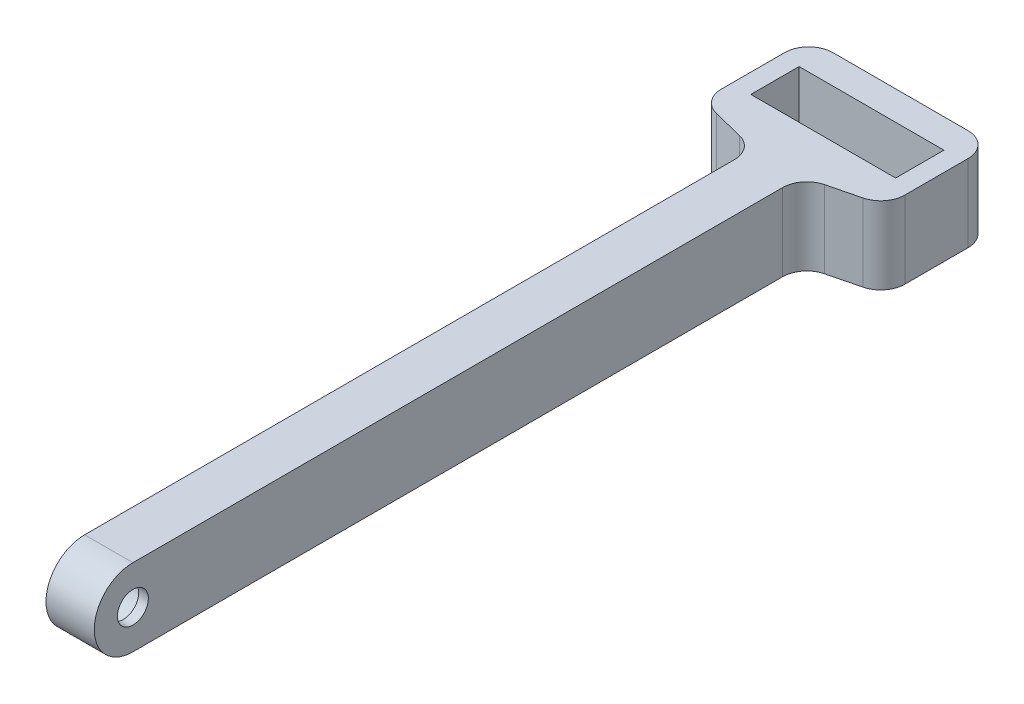
ISO-10303-21;
HEADER;
FILE_DESCRIPTION(('STEP AP214'),'2;1');
FILE_NAME('part.step','',(''),(''),'','','');
FILE_SCHEMA(('AUTOMOTIVE_DESIGN { 1 0 10303 214 1 1 1 1 }'));
ENDSEC;
DATA;
#1=APPLICATION_CONTEXT('core data for automotive mechanical design processes');
#2=APPLICATION_PROTOCOL_DEFINITION('international standard','automotive_design',2000,#1);
#3=PRODUCT_CONTEXT('',#1,'mechanical');
#4=PRODUCT('Part','Part','',(#3));
#5=PRODUCT_RELATED_PRODUCT_CATEGORY('part','',(#4));
#6=PRODUCT_DEFINITION_FORMATION('','',#4);
#7=PRODUCT_DEFINITION_CONTEXT('part definition',#1,'design');
#8=PRODUCT_DEFINITION('design','',#6,#7);
#9=PRODUCT_DEFINITION_SHAPE('','',#8);
#10=(LENGTH_UNIT() NAMED_UNIT(*) SI_UNIT(.MILLI.,.METRE.));
#11=(NAMED_UNIT(*) PLANE_ANGLE_UNIT() SI_UNIT($,.RADIAN.));
#12=(NAMED_UNIT(*) SI_UNIT($,.STERADIAN.) SOLID_ANGLE_UNIT());
#13=UNCERTAINTY_MEASURE_WITH_UNIT(LENGTH_MEASURE(1.E-05),#10,'distance_accuracy_value','');
#14=(GEOMETRIC_REPRESENTATION_CONTEXT(3) GLOBAL_UNCERTAINTY_ASSIGNED_CONTEXT((#13)) GLOBAL_UNIT_ASSIGNED_CONTEXT((#10,
#11,#12)) REPRESENTATION_CONTEXT('',''));
#15=CARTESIAN_POINT('',(0.,0.,0.));
#16=DIRECTION('',(0.,0.,1.));
#17=DIRECTION('',(1.,0.,0.));
#18=AXIS2_PLACEMENT_3D('',#15,#16,#17);
#19=CARTESIAN_POINT('',(5.,0.,30.));
#20=DIRECTION('',(-1.,0.,0.));
#21=DIRECTION('',(0.,0.,1.));
#22=AXIS2_PLACEMENT_3D('',#19,#20,#21);
#23=CYLINDRICAL_SURFACE('',#22,1.6);
#24=CARTESIAN_POINT('',(5.,0.,30.));
#25=DIRECTION('',(1.,0.,0.));
#26=DIRECTION('',(0.,0.,-1.));
#27=AXIS2_PLACEMENT_3D('',#24,#25,#26);
#28=CIRCLE('',#27,1.6);
#29=CARTESIAN_POINT('',(5.,0.,28.4));
#30=VERTEX_POINT('',#29);
#31=EDGE_CURVE('E222',#30,#30,#28,.T.);
#32=ORIENTED_EDGE('',*,*,#31,.T.);
#33=EDGE_LOOP('',(#32));
#34=FACE_BOUND('',#33,.T.);
#35=CARTESIAN_POINT('',(4.,0.,30.));
#36=DIRECTION('',(-1.,0.,0.));
#37=DIRECTION('',(0.,0.,1.));
#38=AXIS2_PLACEMENT_3D('',#35,#36,#37);
#39=CIRCLE('',#38,1.6);
#40=CARTESIAN_POINT('',(4.,0.,31.6));
#41=VERTEX_POINT('',#40);
#42=EDGE_CURVE('E200',#41,#41,#39,.T.);
#43=ORIENTED_EDGE('',*,*,#42,.T.);
#44=EDGE_LOOP('',(#43));
#45=FACE_BOUND('',#44,.T.);
#46=ADVANCED_FACE('F37',(#34,#45),#23,.F.);
#47=CARTESIAN_POINT('',(5.,0.,30.));
#48=DIRECTION('',(1.,0.,0.));
#49=DIRECTION('',(0.,0.,-1.));
#50=AXIS2_PLACEMENT_3D('',#47,#48,#49);
#51=PLANE('',#50);
#52=ORIENTED_EDGE('',*,*,#31,.F.);
#53=EDGE_LOOP('',(#52));
#54=FACE_BOUND('',#53,.T.);
#55=DIRECTION('',(0.,0.,-1.));
#56=VECTOR('',#55,1.);
#57=CARTESIAN_POINT('',(5.,-4.,-41.));
#58=LINE('',#57,#56);
#59=CARTESIAN_POINT('',(5.,-4.,30.));
#60=VERTEX_POINT('',#59);
#61=CARTESIAN_POINT('',(5.,-4.,-37.2980589839889));
#62=VERTEX_POINT('',#61);
#63=EDGE_CURVE('E233',#60,#62,#58,.T.);
#64=ORIENTED_EDGE('',*,*,#63,.T.);
#65=DIRECTION('',(0.,1.,0.));
#66=VECTOR('',#65,1.);
#67=CARTESIAN_POINT('',(5.,0.,-37.2980589839889));
#68=LINE('',#67,#66);
#69=CARTESIAN_POINT('',(5.,4.,-37.2980589839889));
#70=VERTEX_POINT('',#69);
#71=EDGE_CURVE('E251',#62,#70,#68,.T.);
#72=ORIENTED_EDGE('',*,*,#71,.T.);
#73=DIRECTION('',(0.,0.,1.));
#74=VECTOR('',#73,1.);
#75=CARTESIAN_POINT('',(5.,4.,30.));
#76=LINE('',#75,#74);
#77=CARTESIAN_POINT('',(5.,4.,30.));
#78=VERTEX_POINT('',#77);
#79=EDGE_CURVE('E237',#70,#78,#76,.T.);
#80=ORIENTED_EDGE('',*,*,#79,.T.);
#81=CARTESIAN_POINT('',(5.,0.,30.));
#82=DIRECTION('',(1.,0.,0.));
#83=DIRECTION('',(0.,0.,-1.));
#84=AXIS2_PLACEMENT_3D('',#81,#82,#83);
#85=CIRCLE('',#84,4.);
#86=EDGE_CURVE('E230',#78,#60,#85,.T.);
#87=ORIENTED_EDGE('',*,*,#86,.T.);
#88=EDGE_LOOP('',(#64,#72,#80,#87));
#89=FACE_BOUND('',#88,.T.);
#90=ADVANCED_FACE('F353',(#54,#89),#51,.T.);
#91=CARTESIAN_POINT('',(0.,0.,30.));
#92=DIRECTION('',(1.,0.,0.));
#93=DIRECTION('',(0.,0.,-1.));
#94=AXIS2_PLACEMENT_3D('',#91,#92,#93);
#95=PLANE('',#94);
#96=CARTESIAN_POINT('',(0.,0.,30.));
#97=DIRECTION('',(-1.,0.,0.));
#98=DIRECTION('',(0.,0.,1.));
#99=AXIS2_PLACEMENT_3D('',#96,#97,#98);
#100=CIRCLE('',#99,2.4);
#101=CARTESIAN_POINT('',(0.,0.,32.4));
#102=VERTEX_POINT('',#101);
#103=EDGE_CURVE('E337',#102,#102,#100,.T.);
#104=ORIENTED_EDGE('',*,*,#103,.F.);
#105=EDGE_LOOP('',(#104));
#106=FACE_BOUND('',#105,.T.);
#107=DIRECTION('',(0.,0.,1.));
#108=VECTOR('',#107,1.);
#109=CARTESIAN_POINT('',(0.,4.,30.));
#110=LINE('',#109,#108);
#111=CARTESIAN_POINT('',(0.,4.,-37.298058983989));
#112=VERTEX_POINT('',#111);
#113=CARTESIAN_POINT('',(0.,4.,30.));
#114=VERTEX_POINT('',#113);
#115=EDGE_CURVE('E234',#112,#114,#110,.T.);
#116=ORIENTED_EDGE('',*,*,#115,.F.);
#117=DIRECTION('',(0.,1.,0.));
#118=VECTOR('',#117,1.);
#119=CARTESIAN_POINT('',(0.,0.,-37.298058983989));
#120=LINE('',#119,#118);
#121=CARTESIAN_POINT('',(0.,-4.,-37.298058983989));
#122=VERTEX_POINT('',#121);
#123=EDGE_CURVE('E296',#112,#122,#120,.F.);
#124=ORIENTED_EDGE('',*,*,#123,.T.);
#125=DIRECTION('',(0.,0.,-1.));
#126=VECTOR('',#125,1.);
#127=CARTESIAN_POINT('',(0.,-4.,-41.));
#128=LINE('',#127,#126);
#129=CARTESIAN_POINT('',(0.,-4.,30.));
#130=VERTEX_POINT('',#129);
#131=EDGE_CURVE('E242',#130,#122,#128,.T.);
#132=ORIENTED_EDGE('',*,*,#131,.F.);
#133=CARTESIAN_POINT('',(0.,0.,30.));
#134=DIRECTION('',(1.,0.,0.));
#135=DIRECTION('',(0.,0.,-1.));
#136=AXIS2_PLACEMENT_3D('',#133,#134,#135);
#137=CIRCLE('',#136,4.);
#138=EDGE_CURVE('E229',#114,#130,#137,.T.);
#139=ORIENTED_EDGE('',*,*,#138,.F.);
#140=EDGE_LOOP('',(#116,#124,#132,#139));
#141=FACE_BOUND('',#140,.T.);
#142=ADVANCED_FACE('F313',(#106,#141),#95,.F.);
#143=CARTESIAN_POINT('',(5.,0.,30.));
#144=DIRECTION('',(-1.,0.,0.));
#145=DIRECTION('',(0.,0.,1.));
#146=AXIS2_PLACEMENT_3D('',#143,#144,#145);
#147=CYLINDRICAL_SURFACE('',#146,4.);
#148=ORIENTED_EDGE('',*,*,#138,.T.);
#149=DIRECTION('',(-1.,0.,0.));
#150=VECTOR('',#149,1.);
#151=CARTESIAN_POINT('',(5.,-4.,30.));
#152=LINE('',#151,#150);
#153=EDGE_CURVE('E248',#60,#130,#152,.T.);
#154=ORIENTED_EDGE('',*,*,#153,.F.);
#155=ORIENTED_EDGE('',*,*,#86,.F.);
#156=DIRECTION('',(-1.,0.,0.));
#157=VECTOR('',#156,1.);
#158=CARTESIAN_POINT('',(5.,4.,30.));
#159=LINE('',#158,#157);
#160=EDGE_CURVE('E239',#78,#114,#159,.T.);
#161=ORIENTED_EDGE('',*,*,#160,.T.);
#162=EDGE_LOOP('',(#148,#154,#155,#161));
#163=FACE_BOUND('',#162,.T.);
#164=ADVANCED_FACE('F352',(#163),#147,.T.);
#165=CARTESIAN_POINT('',(5.,-4.,-41.));
#166=DIRECTION('',(0.,1.,0.));
#167=DIRECTION('',(0.,0.,1.));
#168=AXIS2_PLACEMENT_3D('',#165,#166,#167);
#169=PLANE('',#168);
#170=DIRECTION('',(0.,0.,-1.));
#171=VECTOR('',#170,1.);
#172=CARTESIAN_POINT('',(12.,-4.,0.));
#173=LINE('',#172,#171);
#174=CARTESIAN_POINT('',(12.,-4.,-42.951941016011));
#175=VERTEX_POINT('',#174);
#176=CARTESIAN_POINT('',(12.,-4.,-49.5));
#177=VERTEX_POINT('',#176);
#178=EDGE_CURVE('E330',#175,#177,#173,.T.);
#179=ORIENTED_EDGE('',*,*,#178,.F.);
#180=CARTESIAN_POINT('',(9.5,-4.,-42.951941016011));
#181=DIRECTION('',(0.,1.,0.));
#182=DIRECTION('',(0.,0.,1.));
#183=AXIS2_PLACEMENT_3D('',#180,#181,#182);
#184=CIRCLE('',#183,2.5);
#185=CARTESIAN_POINT('',(10.1063390625908,-4.,-40.5265847656477));
#186=VERTEX_POINT('',#185);
#187=EDGE_CURVE('E280',#175,#186,#184,.F.);
#188=ORIENTED_EDGE('',*,*,#187,.T.);
#189=DIRECTION('',(-0.970142500145332,0.,0.242535625036333));
#190=VECTOR('',#189,1.);
#191=CARTESIAN_POINT('',(-8.94117647058824,-4.,-35.7647058823529));
#192=LINE('',#191,#190);
#193=CARTESIAN_POINT('',(6.89366093740917,-4.,-39.7234152343523));
#194=VERTEX_POINT('',#193);
#195=EDGE_CURVE('E220',#186,#194,#192,.T.);
#196=ORIENTED_EDGE('',*,*,#195,.T.);
#197=CARTESIAN_POINT('',(7.5,-4.,-37.2980589839889));
#198=DIRECTION('',(0.,1.,0.));
#199=DIRECTION('',(0.,0.,1.));
#200=AXIS2_PLACEMENT_3D('',#197,#198,#199);
#201=CIRCLE('',#200,2.5);
#202=EDGE_CURVE('E300',#194,#62,#201,.T.);
#203=ORIENTED_EDGE('',*,*,#202,.T.);
#204=ORIENTED_EDGE('',*,*,#63,.F.);
#205=ORIENTED_EDGE('',*,*,#153,.T.);
#206=ORIENTED_EDGE('',*,*,#131,.T.);
#207=CARTESIAN_POINT('',(-2.5,-4.,-37.298058983989));
#208=DIRECTION('',(0.,1.,0.));
#209=DIRECTION('',(0.,0.,1.));
#210=AXIS2_PLACEMENT_3D('',#207,#208,#209);
#211=CIRCLE('',#210,2.5);
#212=CARTESIAN_POINT('',(-1.89366093740917,-4.,-39.7234152343523));
#213=VERTEX_POINT('',#212);
#214=EDGE_CURVE('E11',#122,#213,#211,.T.);
#215=ORIENTED_EDGE('',*,*,#214,.T.);
#216=DIRECTION('',(0.970142500145332,0.,0.242535625036333));
#217=VECTOR('',#216,1.);
#218=CARTESIAN_POINT('',(9.23529411764707,-4.,-36.9411764705882));
#219=LINE('',#218,#217);
#220=CARTESIAN_POINT('',(-5.10633906259083,-4.,-40.5265847656477));
#221=VERTEX_POINT('',#220);
#222=EDGE_CURVE('E187',#221,#213,#219,.T.);
#223=ORIENTED_EDGE('',*,*,#222,.F.);
#224=CARTESIAN_POINT('',(-4.5,-4.,-42.951941016011));
#225=DIRECTION('',(0.,1.,0.));
#226=DIRECTION('',(0.,0.,1.));
#227=AXIS2_PLACEMENT_3D('',#224,#225,#226);
#228=CIRCLE('',#227,2.5);
#229=CARTESIAN_POINT('',(-7.,-4.,-42.951941016011));
#230=VERTEX_POINT('',#229);
#231=EDGE_CURVE('E275',#221,#230,#228,.F.);
#232=ORIENTED_EDGE('',*,*,#231,.T.);
#233=DIRECTION('',(0.,0.,-1.));
#234=VECTOR('',#233,1.);
#235=CARTESIAN_POINT('',(-6.99999999999999,-4.,0.));
#236=LINE('',#235,#234);
#237=CARTESIAN_POINT('',(-7.,-4.,-49.5));
#238=VERTEX_POINT('',#237);
#239=EDGE_CURVE('E190',#230,#238,#236,.T.);
#240=ORIENTED_EDGE('',*,*,#239,.T.);
#241=CARTESIAN_POINT('',(-4.5,-4.,-49.5));
#242=DIRECTION('',(0.,1.,0.));
#243=DIRECTION('',(0.,0.,1.));
#244=AXIS2_PLACEMENT_3D('',#241,#242,#243);
#245=CIRCLE('',#244,2.5);
#246=CARTESIAN_POINT('',(-4.5,-4.,-52.));
#247=VERTEX_POINT('',#246);
#248=EDGE_CURVE('E59',#238,#247,#245,.F.);
#249=ORIENTED_EDGE('',*,*,#248,.T.);
#250=DIRECTION('',(1.,0.,0.));
#251=VECTOR('',#250,1.);
#252=CARTESIAN_POINT('',(0.,-4.,-52.));
#253=LINE('',#252,#251);
#254=CARTESIAN_POINT('',(9.5,-4.,-52.));
#255=VERTEX_POINT('',#254);
#256=EDGE_CURVE('E329',#247,#255,#253,.T.);
#257=ORIENTED_EDGE('',*,*,#256,.T.);
#258=CARTESIAN_POINT('',(9.5,-4.,-49.5));
#259=DIRECTION('',(0.,1.,0.));
#260=DIRECTION('',(0.,0.,1.));
#261=AXIS2_PLACEMENT_3D('',#258,#259,#260);
#262=CIRCLE('',#261,2.5);
#263=EDGE_CURVE('E278',#255,#177,#262,.F.);
#264=ORIENTED_EDGE('',*,*,#263,.T.);
#265=EDGE_LOOP('',(#179,#188,#196,#203,#204,#205,#206,#215,#223,#232,#240,#249,#257,#264));
#266=FACE_BOUND('',#265,.T.);
#267=DIRECTION('',(-1.,0.,0.));
#268=VECTOR('',#267,1.);
#269=CARTESIAN_POINT('',(0.,-4.,-44.));
#270=LINE('',#269,#268);
#271=CARTESIAN_POINT('',(10.,-4.,-44.));
#272=VERTEX_POINT('',#271);
#273=CARTESIAN_POINT('',(-5.,-4.,-44.));
#274=VERTEX_POINT('',#273);
#275=EDGE_CURVE('E180',#272,#274,#270,.T.);
#276=ORIENTED_EDGE('',*,*,#275,.F.);
#277=DIRECTION('',(0.,0.,-1.));
#278=VECTOR('',#277,1.);
#279=CARTESIAN_POINT('',(10.,-4.,0.));
#280=LINE('',#279,#278);
#281=CARTESIAN_POINT('',(10.,-4.,-49.));
#282=VERTEX_POINT('',#281);
#283=EDGE_CURVE('E174',#272,#282,#280,.T.);
#284=ORIENTED_EDGE('',*,*,#283,.T.);
#285=DIRECTION('',(-1.,0.,0.));
#286=VECTOR('',#285,1.);
#287=CARTESIAN_POINT('',(0.,-4.,-49.));
#288=LINE('',#287,#286);
#289=CARTESIAN_POINT('',(-5.,-4.,-49.));
#290=VERTEX_POINT('',#289);
#291=EDGE_CURVE('E181',#282,#290,#288,.T.);
#292=ORIENTED_EDGE('',*,*,#291,.T.);
#293=DIRECTION('',(0.,0.,-1.));
#294=VECTOR('',#293,1.);
#295=CARTESIAN_POINT('',(-5.,-4.,0.));
#296=LINE('',#295,#294);
#297=EDGE_CURVE('E166',#274,#290,#296,.T.);
#298=ORIENTED_EDGE('',*,*,#297,.F.);
#299=EDGE_LOOP('',(#276,#284,#292,#298));
#300=FACE_BOUND('',#299,.T.);
#301=ADVANCED_FACE('F178',(#266,#300),#169,.F.);
#302=CARTESIAN_POINT('',(5.,4.,30.));
#303=DIRECTION('',(0.,-1.,0.));
#304=DIRECTION('',(0.,0.,-1.));
#305=AXIS2_PLACEMENT_3D('',#302,#303,#304);
#306=PLANE('',#305);
#307=DIRECTION('',(-0.970142500145332,0.,0.242535625036333));
#308=VECTOR('',#307,1.);
#309=CARTESIAN_POINT('',(-8.94117647058824,4.,-35.7647058823529));
#310=LINE('',#309,#308);
#311=CARTESIAN_POINT('',(10.1063390625908,4.,-40.5265847656477));
#312=VERTEX_POINT('',#311);
#313=CARTESIAN_POINT('',(6.89366093740917,4.,-39.7234152343523));
#314=VERTEX_POINT('',#313);
#315=EDGE_CURVE('E196',#312,#314,#310,.T.);
#316=ORIENTED_EDGE('',*,*,#315,.F.);
#317=CARTESIAN_POINT('',(9.5,4.,-42.951941016011));
#318=DIRECTION('',(0.,-1.,0.));
#319=DIRECTION('',(0.,0.,-1.));
#320=AXIS2_PLACEMENT_3D('',#317,#318,#319);
#321=CIRCLE('',#320,2.5);
#322=CARTESIAN_POINT('',(12.,4.,-42.951941016011));
#323=VERTEX_POINT('',#322);
#324=EDGE_CURVE('E268',#312,#323,#321,.F.);
#325=ORIENTED_EDGE('',*,*,#324,.T.);
#326=DIRECTION('',(0.,0.,-1.));
#327=VECTOR('',#326,1.);
#328=CARTESIAN_POINT('',(12.,4.,0.));
#329=LINE('',#328,#327);
#330=CARTESIAN_POINT('',(12.,4.,-49.5));
#331=VERTEX_POINT('',#330);
#332=EDGE_CURVE('E199',#323,#331,#329,.T.);
#333=ORIENTED_EDGE('',*,*,#332,.T.);
#334=CARTESIAN_POINT('',(9.5,4.,-49.5));
#335=DIRECTION('',(0.,-1.,0.));
#336=DIRECTION('',(0.,0.,-1.));
#337=AXIS2_PLACEMENT_3D('',#334,#335,#336);
#338=CIRCLE('',#337,2.5);
#339=CARTESIAN_POINT('',(9.5,4.,-52.));
#340=VERTEX_POINT('',#339);
#341=EDGE_CURVE('E266',#331,#340,#338,.F.);
#342=ORIENTED_EDGE('',*,*,#341,.T.);
#343=DIRECTION('',(1.,0.,0.));
#344=VECTOR('',#343,1.);
#345=CARTESIAN_POINT('',(0.,4.,-52.));
#346=LINE('',#345,#344);
#347=CARTESIAN_POINT('',(-4.5,4.,-52.));
#348=VERTEX_POINT('',#347);
#349=EDGE_CURVE('E203',#348,#340,#346,.T.);
#350=ORIENTED_EDGE('',*,*,#349,.F.);
#351=CARTESIAN_POINT('',(-4.5,4.,-49.5));
#352=DIRECTION('',(0.,-1.,0.));
#353=DIRECTION('',(0.,0.,-1.));
#354=AXIS2_PLACEMENT_3D('',#351,#352,#353);
#355=CIRCLE('',#354,2.5);
#356=CARTESIAN_POINT('',(-7.,4.,-49.5));
#357=VERTEX_POINT('',#356);
#358=EDGE_CURVE('E264',#348,#357,#355,.F.);
#359=ORIENTED_EDGE('',*,*,#358,.T.);
#360=DIRECTION('',(0.,0.,-1.));
#361=VECTOR('',#360,1.);
#362=CARTESIAN_POINT('',(-6.99999999999999,4.,0.));
#363=LINE('',#362,#361);
#364=CARTESIAN_POINT('',(-7.,4.,-42.951941016011));
#365=VERTEX_POINT('',#364);
#366=EDGE_CURVE('E205',#365,#357,#363,.T.);
#367=ORIENTED_EDGE('',*,*,#366,.F.);
#368=CARTESIAN_POINT('',(-4.5,4.,-42.951941016011));
#369=DIRECTION('',(0.,-1.,0.));
#370=DIRECTION('',(0.,0.,-1.));
#371=AXIS2_PLACEMENT_3D('',#368,#369,#370);
#372=CIRCLE('',#371,2.5);
#373=CARTESIAN_POINT('',(-5.10633906259083,4.,-40.5265847656477));
#374=VERTEX_POINT('',#373);
#375=EDGE_CURVE('E262',#365,#374,#372,.F.);
#376=ORIENTED_EDGE('',*,*,#375,.T.);
#377=DIRECTION('',(0.970142500145332,0.,0.242535625036333));
#378=VECTOR('',#377,1.);
#379=CARTESIAN_POINT('',(9.23529411764707,4.,-36.9411764705882));
#380=LINE('',#379,#378);
#381=CARTESIAN_POINT('',(-1.89366093740917,4.,-39.7234152343523));
#382=VERTEX_POINT('',#381);
#383=EDGE_CURVE('E208',#374,#382,#380,.T.);
#384=ORIENTED_EDGE('',*,*,#383,.T.);
#385=CARTESIAN_POINT('',(-2.5,4.,-37.298058983989));
#386=DIRECTION('',(0.,-1.,0.));
#387=DIRECTION('',(0.,0.,-1.));
#388=AXIS2_PLACEMENT_3D('',#385,#386,#387);
#389=CIRCLE('',#388,2.5);
#390=EDGE_CURVE('E45',#382,#112,#389,.T.);
#391=ORIENTED_EDGE('',*,*,#390,.T.);
#392=ORIENTED_EDGE('',*,*,#115,.T.);
#393=ORIENTED_EDGE('',*,*,#160,.F.);
#394=ORIENTED_EDGE('',*,*,#79,.F.);
#395=CARTESIAN_POINT('',(7.5,4.,-37.2980589839889));
#396=DIRECTION('',(0.,-1.,0.));
#397=DIRECTION('',(0.,0.,-1.));
#398=AXIS2_PLACEMENT_3D('',#395,#396,#397);
#399=CIRCLE('',#398,2.5);
#400=EDGE_CURVE('E298',#70,#314,#399,.T.);
#401=ORIENTED_EDGE('',*,*,#400,.T.);
#402=EDGE_LOOP('',(#316,#325,#333,#342,#350,#359,#367,#376,#384,#391,#392,#393,#394,#401));
#403=FACE_BOUND('',#402,.T.);
#404=DIRECTION('',(-1.,0.,0.));
#405=VECTOR('',#404,1.);
#406=CARTESIAN_POINT('',(0.,4.,-44.));
#407=LINE('',#406,#405);
#408=CARTESIAN_POINT('',(10.,4.,-44.));
#409=VERTEX_POINT('',#408);
#410=CARTESIAN_POINT('',(-5.,4.,-44.));
#411=VERTEX_POINT('',#410);
#412=EDGE_CURVE('E211',#409,#411,#407,.T.);
#413=ORIENTED_EDGE('',*,*,#412,.T.);
#414=DIRECTION('',(0.,0.,-1.));
#415=VECTOR('',#414,1.);
#416=CARTESIAN_POINT('',(-5.,4.,0.));
#417=LINE('',#416,#415);
#418=CARTESIAN_POINT('',(-5.,4.,-49.));
#419=VERTEX_POINT('',#418);
#420=EDGE_CURVE('E168',#411,#419,#417,.T.);
#421=ORIENTED_EDGE('',*,*,#420,.T.);
#422=DIRECTION('',(-1.,0.,0.));
#423=VECTOR('',#422,1.);
#424=CARTESIAN_POINT('',(0.,4.,-49.));
#425=LINE('',#424,#423);
#426=CARTESIAN_POINT('',(10.,4.,-49.));
#427=VERTEX_POINT('',#426);
#428=EDGE_CURVE('E214',#427,#419,#425,.T.);
#429=ORIENTED_EDGE('',*,*,#428,.F.);
#430=DIRECTION('',(0.,0.,-1.));
#431=VECTOR('',#430,1.);
#432=CARTESIAN_POINT('',(10.,4.,0.));
#433=LINE('',#432,#431);
#434=EDGE_CURVE('E217',#409,#427,#433,.T.);
#435=ORIENTED_EDGE('',*,*,#434,.F.);
#436=EDGE_LOOP('',(#413,#421,#429,#435));
#437=FACE_BOUND('',#436,.T.);
#438=ADVANCED_FACE('F304',(#403,#437),#306,.F.);
#439=CARTESIAN_POINT('',(0.,-4.,-44.));
#440=DIRECTION('',(0.,0.,-1.));
#441=DIRECTION('',(-1.,0.,0.));
#442=AXIS2_PLACEMENT_3D('',#439,#440,#441);
#443=PLANE('',#442);
#444=ORIENTED_EDGE('',*,*,#412,.F.);
#445=DIRECTION('',(0.,1.,0.));
#446=VECTOR('',#445,1.);
#447=CARTESIAN_POINT('',(10.,-4.,-44.));
#448=LINE('',#447,#446);
#449=EDGE_CURVE('E185',#272,#409,#448,.T.);
#450=ORIENTED_EDGE('',*,*,#449,.F.);
#451=ORIENTED_EDGE('',*,*,#275,.T.);
#452=DIRECTION('',(0.,1.,0.));
#453=VECTOR('',#452,1.);
#454=CARTESIAN_POINT('',(-5.,-4.,-44.));
#455=LINE('',#454,#453);
#456=EDGE_CURVE('E163',#274,#411,#455,.T.);
#457=ORIENTED_EDGE('',*,*,#456,.T.);
#458=EDGE_LOOP('',(#444,#450,#451,#457));
#459=FACE_BOUND('',#458,.T.);
#460=ADVANCED_FACE('F184',(#459),#443,.T.);
#461=CARTESIAN_POINT('',(10.,-4.,0.));
#462=DIRECTION('',(1.,0.,0.));
#463=DIRECTION('',(0.,0.,-1.));
#464=AXIS2_PLACEMENT_3D('',#461,#462,#463);
#465=PLANE('',#464);
#466=ORIENTED_EDGE('',*,*,#434,.T.);
#467=DIRECTION('',(0.,1.,0.));
#468=VECTOR('',#467,1.);
#469=CARTESIAN_POINT('',(10.,-4.,-49.));
#470=LINE('',#469,#468);
#471=EDGE_CURVE('E223',#282,#427,#470,.T.);
#472=ORIENTED_EDGE('',*,*,#471,.F.);
#473=ORIENTED_EDGE('',*,*,#283,.F.);
#474=ORIENTED_EDGE('',*,*,#449,.T.);
#475=EDGE_LOOP('',(#466,#472,#473,#474));
#476=FACE_BOUND('',#475,.T.);
#477=ADVANCED_FACE('F389',(#476),#465,.F.);
#478=CARTESIAN_POINT('',(0.,-4.,-49.));
#479=DIRECTION('',(0.,0.,-1.));
#480=DIRECTION('',(-1.,0.,0.));
#481=AXIS2_PLACEMENT_3D('',#478,#479,#480);
#482=PLANE('',#481);
#483=ORIENTED_EDGE('',*,*,#428,.T.);
#484=DIRECTION('',(0.,1.,0.));
#485=VECTOR('',#484,1.);
#486=CARTESIAN_POINT('',(-5.,-4.,-49.));
#487=LINE('',#486,#485);
#488=EDGE_CURVE('E173',#290,#419,#487,.T.);
#489=ORIENTED_EDGE('',*,*,#488,.F.);
#490=ORIENTED_EDGE('',*,*,#291,.F.);
#491=ORIENTED_EDGE('',*,*,#471,.T.);
#492=EDGE_LOOP('',(#483,#489,#490,#491));
#493=FACE_BOUND('',#492,.T.);
#494=ADVANCED_FACE('F386',(#493),#482,.F.);
#495=CARTESIAN_POINT('',(9.23529411764707,-4.,-36.9411764705882));
#496=DIRECTION('',(-0.242535625036333,0.,0.970142500145332));
#497=DIRECTION('',(0.970142500145332,0.,0.242535625036333));
#498=AXIS2_PLACEMENT_3D('',#495,#496,#497);
#499=PLANE('',#498);
#500=ORIENTED_EDGE('',*,*,#383,.F.);
#501=DIRECTION('',(0.,1.,0.));
#502=VECTOR('',#501,1.);
#503=CARTESIAN_POINT('',(-5.10633906259083,-4.,-40.5265847656477));
#504=LINE('',#503,#502);
#505=EDGE_CURVE('E294',#374,#221,#504,.F.);
#506=ORIENTED_EDGE('',*,*,#505,.T.);
#507=ORIENTED_EDGE('',*,*,#222,.T.);
#508=DIRECTION('',(0.,1.,0.));
#509=VECTOR('',#508,1.);
#510=CARTESIAN_POINT('',(-1.89366093740917,-4.,-39.7234152343523));
#511=LINE('',#510,#509);
#512=EDGE_CURVE('E291',#213,#382,#511,.T.);
#513=ORIENTED_EDGE('',*,*,#512,.T.);
#514=EDGE_LOOP('',(#500,#506,#507,#513));
#515=FACE_BOUND('',#514,.T.);
#516=ADVANCED_FACE('F319',(#515),#499,.T.);
#517=CARTESIAN_POINT('',(-6.99999999999999,-4.,0.));
#518=DIRECTION('',(1.,0.,0.));
#519=DIRECTION('',(0.,0.,-1.));
#520=AXIS2_PLACEMENT_3D('',#517,#518,#519);
#521=PLANE('',#520);
#522=ORIENTED_EDGE('',*,*,#366,.T.);
#523=DIRECTION('',(0.,1.,0.));
#524=VECTOR('',#523,1.);
#525=CARTESIAN_POINT('',(-7.,-4.,-49.5));
#526=LINE('',#525,#524);
#527=EDGE_CURVE('E289',#357,#238,#526,.F.);
#528=ORIENTED_EDGE('',*,*,#527,.T.);
#529=ORIENTED_EDGE('',*,*,#239,.F.);
#530=DIRECTION('',(0.,1.,0.));
#531=VECTOR('',#530,1.);
#532=CARTESIAN_POINT('',(-7.,4.,-42.951941016011));
#533=LINE('',#532,#531);
#534=EDGE_CURVE('E286',#230,#365,#533,.T.);
#535=ORIENTED_EDGE('',*,*,#534,.T.);
#536=EDGE_LOOP('',(#522,#528,#529,#535));
#537=FACE_BOUND('',#536,.T.);
#538=ADVANCED_FACE('F326',(#537),#521,.F.);
#539=CARTESIAN_POINT('',(0.,-4.,-52.));
#540=DIRECTION('',(0.,0.,1.));
#541=DIRECTION('',(1.,0.,0.));
#542=AXIS2_PLACEMENT_3D('',#539,#540,#541);
#543=PLANE('',#542);
#544=ORIENTED_EDGE('',*,*,#349,.T.);
#545=DIRECTION('',(0.,1.,0.));
#546=VECTOR('',#545,1.);
#547=CARTESIAN_POINT('',(9.5,-4.,-52.));
#548=LINE('',#547,#546);
#549=EDGE_CURVE('E52',#340,#255,#548,.F.);
#550=ORIENTED_EDGE('',*,*,#549,.T.);
#551=ORIENTED_EDGE('',*,*,#256,.F.);
#552=DIRECTION('',(0.,1.,0.));
#553=VECTOR('',#552,1.);
#554=CARTESIAN_POINT('',(-4.5,-4.,-52.));
#555=LINE('',#554,#553);
#556=EDGE_CURVE('E282',#247,#348,#555,.T.);
#557=ORIENTED_EDGE('',*,*,#556,.T.);
#558=EDGE_LOOP('',(#544,#550,#551,#557));
#559=FACE_BOUND('',#558,.T.);
#560=ADVANCED_FACE('F378',(#559),#543,.F.);
#561=CARTESIAN_POINT('',(12.,-4.,0.));
#562=DIRECTION('',(1.,0.,0.));
#563=DIRECTION('',(0.,0.,-1.));
#564=AXIS2_PLACEMENT_3D('',#561,#562,#563);
#565=PLANE('',#564);
#566=ORIENTED_EDGE('',*,*,#332,.F.);
#567=DIRECTION('',(0.,1.,0.));
#568=VECTOR('',#567,1.);
#569=CARTESIAN_POINT('',(12.,-4.,-42.951941016011));
#570=LINE('',#569,#568);
#571=EDGE_CURVE('E273',#323,#175,#570,.F.);
#572=ORIENTED_EDGE('',*,*,#571,.T.);
#573=ORIENTED_EDGE('',*,*,#178,.T.);
#574=DIRECTION('',(0.,1.,0.));
#575=VECTOR('',#574,1.);
#576=CARTESIAN_POINT('',(12.,4.,-49.5));
#577=LINE('',#576,#575);
#578=EDGE_CURVE('E270',#177,#331,#577,.T.);
#579=ORIENTED_EDGE('',*,*,#578,.T.);
#580=EDGE_LOOP('',(#566,#572,#573,#579));
#581=FACE_BOUND('',#580,.T.);
#582=ADVANCED_FACE('F374',(#581),#565,.T.);
#583=CARTESIAN_POINT('',(-8.94117647058824,-4.,-35.7647058823529));
#584=DIRECTION('',(-0.242535625036333,0.,-0.970142500145332));
#585=DIRECTION('',(-0.970142500145332,0.,0.242535625036333));
#586=AXIS2_PLACEMENT_3D('',#583,#584,#585);
#587=PLANE('',#586);
#588=ORIENTED_EDGE('',*,*,#315,.T.);
#589=DIRECTION('',(0.,1.,0.));
#590=VECTOR('',#589,1.);
#591=CARTESIAN_POINT('',(6.89366093740916,-4.,-39.7234152343523));
#592=LINE('',#591,#590);
#593=EDGE_CURVE('E260',#314,#194,#592,.F.);
#594=ORIENTED_EDGE('',*,*,#593,.T.);
#595=ORIENTED_EDGE('',*,*,#195,.F.);
#596=DIRECTION('',(0.,1.,0.));
#597=VECTOR('',#596,1.);
#598=CARTESIAN_POINT('',(10.1063390625908,4.,-40.5265847656477));
#599=LINE('',#598,#597);
#600=EDGE_CURVE('E257',#186,#312,#599,.T.);
#601=ORIENTED_EDGE('',*,*,#600,.T.);
#602=EDGE_LOOP('',(#588,#594,#595,#601));
#603=FACE_BOUND('',#602,.T.);
#604=ADVANCED_FACE('F371',(#603),#587,.F.);
#605=CARTESIAN_POINT('',(-5.,-4.,0.));
#606=DIRECTION('',(1.,0.,0.));
#607=DIRECTION('',(0.,0.,-1.));
#608=AXIS2_PLACEMENT_3D('',#605,#606,#607);
#609=PLANE('',#608);
#610=ORIENTED_EDGE('',*,*,#420,.F.);
#611=ORIENTED_EDGE('',*,*,#456,.F.);
#612=ORIENTED_EDGE('',*,*,#297,.T.);
#613=ORIENTED_EDGE('',*,*,#488,.T.);
#614=EDGE_LOOP('',(#610,#611,#612,#613));
#615=FACE_BOUND('',#614,.T.);
#616=ADVANCED_FACE('F165',(#615),#609,.T.);
#617=CARTESIAN_POINT('',(4.,0.,30.));
#618=DIRECTION('',(-1.,0.,0.));
#619=DIRECTION('',(0.,0.,1.));
#620=AXIS2_PLACEMENT_3D('',#617,#618,#619);
#621=CYLINDRICAL_SURFACE('',#620,2.4);
#622=CARTESIAN_POINT('',(4.,0.,30.));
#623=DIRECTION('',(-1.,0.,0.));
#624=DIRECTION('',(0.,0.,1.));
#625=AXIS2_PLACEMENT_3D('',#622,#623,#624);
#626=CIRCLE('',#625,2.4);
#627=CARTESIAN_POINT('',(4.,0.,32.4));
#628=VERTEX_POINT('',#627);
#629=EDGE_CURVE('E254',#628,#628,#626,.T.);
#630=ORIENTED_EDGE('',*,*,#629,.F.);
#631=EDGE_LOOP('',(#630));
#632=FACE_BOUND('',#631,.T.);
#633=ORIENTED_EDGE('',*,*,#103,.T.);
#634=EDGE_LOOP('',(#633));
#635=FACE_BOUND('',#634,.T.);
#636=ADVANCED_FACE('F345',(#632,#635),#621,.F.);
#637=CARTESIAN_POINT('',(4.,0.,30.));
#638=DIRECTION('',(-1.,0.,0.));
#639=DIRECTION('',(0.,0.,1.));
#640=AXIS2_PLACEMENT_3D('',#637,#638,#639);
#641=PLANE('',#640);
#642=ORIENTED_EDGE('',*,*,#42,.F.);
#643=EDGE_LOOP('',(#642));
#644=FACE_BOUND('',#643,.T.);
#645=ORIENTED_EDGE('',*,*,#629,.T.);
#646=EDGE_LOOP('',(#645));
#647=FACE_BOUND('',#646,.T.);
#648=ADVANCED_FACE('F343',(#644,#647),#641,.T.);
#649=CARTESIAN_POINT('',(7.5,0.,-37.2980589839889));
#650=DIRECTION('',(0.,1.,0.));
#651=DIRECTION('',(0.,0.,1.));
#652=AXIS2_PLACEMENT_3D('',#649,#650,#651);
#653=CYLINDRICAL_SURFACE('',#652,2.5);
#654=ORIENTED_EDGE('',*,*,#202,.F.);
#655=ORIENTED_EDGE('',*,*,#593,.F.);
#656=ORIENTED_EDGE('',*,*,#400,.F.);
#657=ORIENTED_EDGE('',*,*,#71,.F.);
#658=EDGE_LOOP('',(#654,#655,#656,#657));
#659=FACE_BOUND('',#658,.T.);
#660=ADVANCED_FACE('F399',(#659),#653,.F.);
#661=CARTESIAN_POINT('',(9.5,-4.,-42.951941016011));
#662=DIRECTION('',(0.,-1.,0.));
#663=DIRECTION('',(0.,0.,-1.));
#664=AXIS2_PLACEMENT_3D('',#661,#662,#663);
#665=CYLINDRICAL_SURFACE('',#664,2.5);
#666=ORIENTED_EDGE('',*,*,#187,.F.);
#667=ORIENTED_EDGE('',*,*,#571,.F.);
#668=ORIENTED_EDGE('',*,*,#324,.F.);
#669=ORIENTED_EDGE('',*,*,#600,.F.);
#670=EDGE_LOOP('',(#666,#667,#668,#669));
#671=FACE_BOUND('',#670,.T.);
#672=ADVANCED_FACE('F404',(#671),#665,.T.);
#673=CARTESIAN_POINT('',(9.5,-4.,-49.5));
#674=DIRECTION('',(0.,-1.,0.));
#675=DIRECTION('',(0.,0.,-1.));
#676=AXIS2_PLACEMENT_3D('',#673,#674,#675);
#677=CYLINDRICAL_SURFACE('',#676,2.5);
#678=ORIENTED_EDGE('',*,*,#263,.F.);
#679=ORIENTED_EDGE('',*,*,#549,.F.);
#680=ORIENTED_EDGE('',*,*,#341,.F.);
#681=ORIENTED_EDGE('',*,*,#578,.F.);
#682=EDGE_LOOP('',(#678,#679,#680,#681));
#683=FACE_BOUND('',#682,.T.);
#684=ADVANCED_FACE('F411',(#683),#677,.T.);
#685=CARTESIAN_POINT('',(-4.5,-4.,-49.5));
#686=DIRECTION('',(0.,1.,0.));
#687=DIRECTION('',(0.,0.,1.));
#688=AXIS2_PLACEMENT_3D('',#685,#686,#687);
#689=CYLINDRICAL_SURFACE('',#688,2.5);
#690=ORIENTED_EDGE('',*,*,#248,.F.);
#691=ORIENTED_EDGE('',*,*,#527,.F.);
#692=ORIENTED_EDGE('',*,*,#358,.F.);
#693=ORIENTED_EDGE('',*,*,#556,.F.);
#694=EDGE_LOOP('',(#690,#691,#692,#693));
#695=FACE_BOUND('',#694,.T.);
#696=ADVANCED_FACE('F419',(#695),#689,.T.);
#697=CARTESIAN_POINT('',(-4.5,-4.,-42.951941016011));
#698=DIRECTION('',(0.,-1.,0.));
#699=DIRECTION('',(0.,0.,-1.));
#700=AXIS2_PLACEMENT_3D('',#697,#698,#699);
#701=CYLINDRICAL_SURFACE('',#700,2.5);
#702=ORIENTED_EDGE('',*,*,#231,.F.);
#703=ORIENTED_EDGE('',*,*,#505,.F.);
#704=ORIENTED_EDGE('',*,*,#375,.F.);
#705=ORIENTED_EDGE('',*,*,#534,.F.);
#706=EDGE_LOOP('',(#702,#703,#704,#705));
#707=FACE_BOUND('',#706,.T.);
#708=ADVANCED_FACE('F322',(#707),#701,.T.);
#709=CARTESIAN_POINT('',(-2.5,-4.,-37.298058983989));
#710=DIRECTION('',(0.,1.,0.));
#711=DIRECTION('',(0.,0.,1.));
#712=AXIS2_PLACEMENT_3D('',#709,#710,#711);
#713=CYLINDRICAL_SURFACE('',#712,2.5);
#714=ORIENTED_EDGE('',*,*,#214,.F.);
#715=ORIENTED_EDGE('',*,*,#123,.F.);
#716=ORIENTED_EDGE('',*,*,#390,.F.);
#717=ORIENTED_EDGE('',*,*,#512,.F.);
#718=EDGE_LOOP('',(#714,#715,#716,#717));
#719=FACE_BOUND('',#718,.T.);
#720=ADVANCED_FACE('F39',(#719),#713,.F.);
#721=CLOSED_SHELL('',(#46,#90,#142,#164,#301,#438,#460,#477,#494,#516,#538,#560,#582,#604,#616,
#636,#648,#660,#672,#684,#696,#708,#720));
#722=MANIFOLD_SOLID_BREP('B2',#721);
#723=ADVANCED_BREP_SHAPE_REPRESENTATION('',(#18,#722),#14);
#724=SHAPE_DEFINITION_REPRESENTATION(#9,#723);
ENDSEC;
END-ISO-10303-21;
